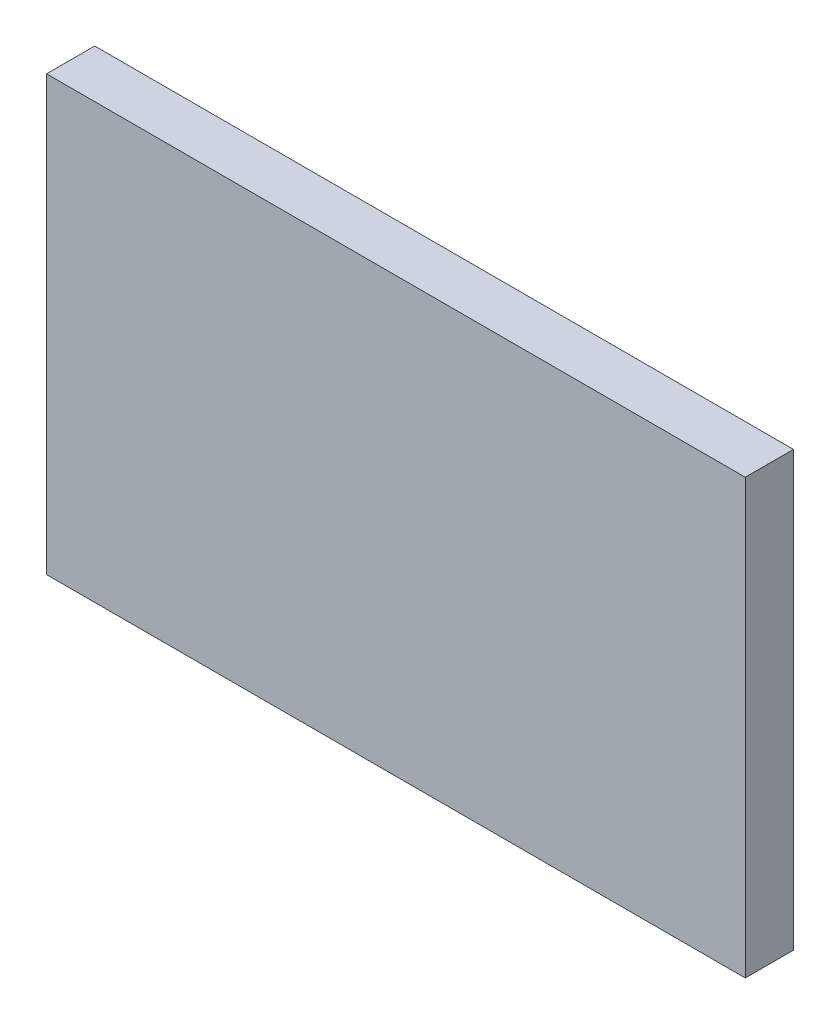
ISO-10303-21;
HEADER;
FILE_DESCRIPTION(('STEP AP214'),'2;1');
FILE_NAME('part.step','',(''),(''),'','','');
FILE_SCHEMA(('AUTOMOTIVE_DESIGN { 1 0 10303 214 1 1 1 1 }'));
ENDSEC;
DATA;
#1=APPLICATION_CONTEXT('core data for automotive mechanical design processes');
#2=APPLICATION_PROTOCOL_DEFINITION('international standard','automotive_design',2000,#1);
#3=PRODUCT_CONTEXT('',#1,'mechanical');
#4=PRODUCT('Part','Part','',(#3));
#5=PRODUCT_RELATED_PRODUCT_CATEGORY('part','',(#4));
#6=PRODUCT_DEFINITION_FORMATION('','',#4);
#7=PRODUCT_DEFINITION_CONTEXT('part definition',#1,'design');
#8=PRODUCT_DEFINITION('design','',#6,#7);
#9=PRODUCT_DEFINITION_SHAPE('','',#8);
#10=(LENGTH_UNIT() NAMED_UNIT(*) SI_UNIT(.MILLI.,.METRE.));
#11=(NAMED_UNIT(*) PLANE_ANGLE_UNIT() SI_UNIT($,.RADIAN.));
#12=(NAMED_UNIT(*) SI_UNIT($,.STERADIAN.) SOLID_ANGLE_UNIT());
#13=UNCERTAINTY_MEASURE_WITH_UNIT(LENGTH_MEASURE(1.E-05),#10,'distance_accuracy_value','');
#14=(GEOMETRIC_REPRESENTATION_CONTEXT(3) GLOBAL_UNCERTAINTY_ASSIGNED_CONTEXT((#13)) GLOBAL_UNIT_ASSIGNED_CONTEXT((#10,
#11,#12)) REPRESENTATION_CONTEXT('',''));
#15=CARTESIAN_POINT('',(0.,0.,0.));
#16=DIRECTION('',(0.,0.,1.));
#17=DIRECTION('',(1.,0.,0.));
#18=AXIS2_PLACEMENT_3D('',#15,#16,#17);
#19=CARTESIAN_POINT('',(46.0375,28.575,6.35));
#20=DIRECTION('',(-1.,0.,0.));
#21=DIRECTION('',(0.,-1.,0.));
#22=AXIS2_PLACEMENT_3D('',#19,#20,#21);
#23=PLANE('',#22);
#24=DIRECTION('',(0.,1.,0.));
#25=VECTOR('',#24,1.);
#26=CARTESIAN_POINT('',(46.0375,28.575,0.));
#27=LINE('',#26,#25);
#28=CARTESIAN_POINT('',(46.0375,-28.575,0.));
#29=VERTEX_POINT('',#28);
#30=CARTESIAN_POINT('',(46.0375,28.575,0.));
#31=VERTEX_POINT('',#30);
#32=EDGE_CURVE('E96',#29,#31,#27,.T.);
#33=ORIENTED_EDGE('',*,*,#32,.T.);
#34=DIRECTION('',(0.,0.,-1.));
#35=VECTOR('',#34,1.);
#36=CARTESIAN_POINT('',(46.0375,28.575,6.35));
#37=LINE('',#36,#35);
#38=CARTESIAN_POINT('',(46.0375,28.575,6.35));
#39=VERTEX_POINT('',#38);
#40=EDGE_CURVE('E11',#39,#31,#37,.T.);
#41=ORIENTED_EDGE('',*,*,#40,.F.);
#42=DIRECTION('',(0.,1.,0.));
#43=VECTOR('',#42,1.);
#44=CARTESIAN_POINT('',(46.0375,28.575,6.35));
#45=LINE('',#44,#43);
#46=CARTESIAN_POINT('',(46.0375,-28.575,6.35));
#47=VERTEX_POINT('',#46);
#48=EDGE_CURVE('E84',#47,#39,#45,.T.);
#49=ORIENTED_EDGE('',*,*,#48,.F.);
#50=DIRECTION('',(0.,0.,-1.));
#51=VECTOR('',#50,1.);
#52=CARTESIAN_POINT('',(46.0375,-28.575,6.35));
#53=LINE('',#52,#51);
#54=EDGE_CURVE('E92',#47,#29,#53,.T.);
#55=ORIENTED_EDGE('',*,*,#54,.T.);
#56=EDGE_LOOP('',(#33,#41,#49,#55));
#57=FACE_BOUND('',#56,.T.);
#58=ADVANCED_FACE('F33',(#57),#23,.F.);
#59=CARTESIAN_POINT('',(-46.0375,28.575,6.35));
#60=DIRECTION('',(0.,-1.,0.));
#61=DIRECTION('',(0.,0.,-1.));
#62=AXIS2_PLACEMENT_3D('',#59,#60,#61);
#63=PLANE('',#62);
#64=DIRECTION('',(-1.,0.,0.));
#65=VECTOR('',#64,1.);
#66=CARTESIAN_POINT('',(-46.0375,28.575,0.));
#67=LINE('',#66,#65);
#68=CARTESIAN_POINT('',(-46.0375,28.575,0.));
#69=VERTEX_POINT('',#68);
#70=EDGE_CURVE('E88',#31,#69,#67,.T.);
#71=ORIENTED_EDGE('',*,*,#70,.T.);
#72=DIRECTION('',(0.,0.,-1.));
#73=VECTOR('',#72,1.);
#74=CARTESIAN_POINT('',(-46.0375,28.575,6.35));
#75=LINE('',#74,#73);
#76=CARTESIAN_POINT('',(-46.0375,28.575,6.35));
#77=VERTEX_POINT('',#76);
#78=EDGE_CURVE('E41',#77,#69,#75,.T.);
#79=ORIENTED_EDGE('',*,*,#78,.F.);
#80=DIRECTION('',(-1.,0.,0.));
#81=VECTOR('',#80,1.);
#82=CARTESIAN_POINT('',(-46.0375,28.575,6.35));
#83=LINE('',#82,#81);
#84=EDGE_CURVE('E79',#39,#77,#83,.T.);
#85=ORIENTED_EDGE('',*,*,#84,.F.);
#86=ORIENTED_EDGE('',*,*,#40,.T.);
#87=EDGE_LOOP('',(#71,#79,#85,#86));
#88=FACE_BOUND('',#87,.T.);
#89=ADVANCED_FACE('F87',(#88),#63,.F.);
#90=CARTESIAN_POINT('',(-46.0375,28.575,6.35));
#91=DIRECTION('',(1.,0.,0.));
#92=DIRECTION('',(0.,1.,0.));
#93=AXIS2_PLACEMENT_3D('',#90,#91,#92);
#94=PLANE('',#93);
#95=DIRECTION('',(0.,-1.,0.));
#96=VECTOR('',#95,1.);
#97=CARTESIAN_POINT('',(-46.0375,28.575,0.));
#98=LINE('',#97,#96);
#99=CARTESIAN_POINT('',(-46.0375,-28.575,0.));
#100=VERTEX_POINT('',#99);
#101=EDGE_CURVE('E66',#69,#100,#98,.T.);
#102=ORIENTED_EDGE('',*,*,#101,.T.);
#103=DIRECTION('',(0.,0.,-1.));
#104=VECTOR('',#103,1.);
#105=CARTESIAN_POINT('',(-46.0375,-28.575,6.35));
#106=LINE('',#105,#104);
#107=CARTESIAN_POINT('',(-46.0375,-28.575,6.35));
#108=VERTEX_POINT('',#107);
#109=EDGE_CURVE('E89',#108,#100,#106,.T.);
#110=ORIENTED_EDGE('',*,*,#109,.F.);
#111=DIRECTION('',(0.,-1.,0.));
#112=VECTOR('',#111,1.);
#113=CARTESIAN_POINT('',(-46.0375,28.575,6.35));
#114=LINE('',#113,#112);
#115=EDGE_CURVE('E82',#77,#108,#114,.T.);
#116=ORIENTED_EDGE('',*,*,#115,.F.);
#117=ORIENTED_EDGE('',*,*,#78,.T.);
#118=EDGE_LOOP('',(#102,#110,#116,#117));
#119=FACE_BOUND('',#118,.T.);
#120=ADVANCED_FACE('F90',(#119),#94,.F.);
#121=CARTESIAN_POINT('',(-46.0375,-28.575,6.35));
#122=DIRECTION('',(0.,1.,0.));
#123=DIRECTION('',(0.,0.,1.));
#124=AXIS2_PLACEMENT_3D('',#121,#122,#123);
#125=PLANE('',#124);
#126=DIRECTION('',(1.,0.,0.));
#127=VECTOR('',#126,1.);
#128=CARTESIAN_POINT('',(-46.0375,-28.575,0.));
#129=LINE('',#128,#127);
#130=EDGE_CURVE('E72',#100,#29,#129,.T.);
#131=ORIENTED_EDGE('',*,*,#130,.T.);
#132=ORIENTED_EDGE('',*,*,#54,.F.);
#133=DIRECTION('',(1.,0.,0.));
#134=VECTOR('',#133,1.);
#135=CARTESIAN_POINT('',(-46.0375,-28.575,6.35));
#136=LINE('',#135,#134);
#137=EDGE_CURVE('E49',#108,#47,#136,.T.);
#138=ORIENTED_EDGE('',*,*,#137,.F.);
#139=ORIENTED_EDGE('',*,*,#109,.T.);
#140=EDGE_LOOP('',(#131,#132,#138,#139));
#141=FACE_BOUND('',#140,.T.);
#142=ADVANCED_FACE('F103',(#141),#125,.F.);
#143=CARTESIAN_POINT('',(0.,0.,6.35));
#144=DIRECTION('',(0.,0.,1.));
#145=DIRECTION('',(1.,0.,0.));
#146=AXIS2_PLACEMENT_3D('',#143,#144,#145);
#147=PLANE('',#146);
#148=ORIENTED_EDGE('',*,*,#48,.T.);
#149=ORIENTED_EDGE('',*,*,#84,.T.);
#150=ORIENTED_EDGE('',*,*,#115,.T.);
#151=ORIENTED_EDGE('',*,*,#137,.T.);
#152=EDGE_LOOP('',(#148,#149,#150,#151));
#153=FACE_BOUND('',#152,.T.);
#154=ADVANCED_FACE('F80',(#153),#147,.T.);
#155=CARTESIAN_POINT('',(0.,0.,0.));
#156=DIRECTION('',(0.,0.,1.));
#157=DIRECTION('',(1.,0.,0.));
#158=AXIS2_PLACEMENT_3D('',#155,#156,#157);
#159=PLANE('',#158);
#160=ORIENTED_EDGE('',*,*,#32,.F.);
#161=ORIENTED_EDGE('',*,*,#130,.F.);
#162=ORIENTED_EDGE('',*,*,#101,.F.);
#163=ORIENTED_EDGE('',*,*,#70,.F.);
#164=EDGE_LOOP('',(#160,#161,#162,#163));
#165=FACE_BOUND('',#164,.T.);
#166=ADVANCED_FACE('F106',(#165),#159,.F.);
#167=CLOSED_SHELL('',(#58,#89,#120,#142,#154,#166));
#168=MANIFOLD_SOLID_BREP('B2',#167);
#169=ADVANCED_BREP_SHAPE_REPRESENTATION('',(#18,#168),#14);
#170=SHAPE_DEFINITION_REPRESENTATION(#9,#169);
ENDSEC;
END-ISO-10303-21;
